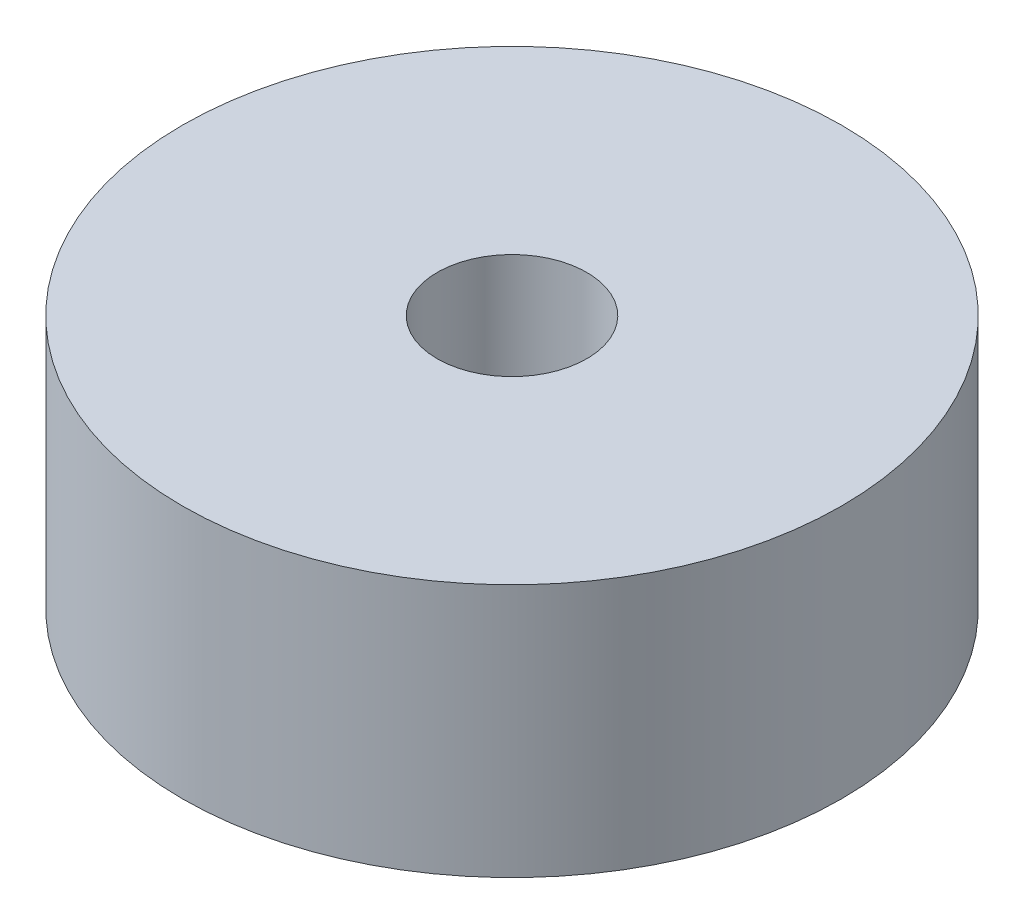
ISO-10303-21;
HEADER;
FILE_DESCRIPTION(('STEP AP214'),'2;1');
FILE_NAME('part.step','',(''),(''),'','','');
FILE_SCHEMA(('AUTOMOTIVE_DESIGN { 1 0 10303 214 1 1 1 1 }'));
ENDSEC;
DATA;
#1=APPLICATION_CONTEXT('core data for automotive mechanical design processes');
#2=APPLICATION_PROTOCOL_DEFINITION('international standard','automotive_design',2000,#1);
#3=PRODUCT_CONTEXT('',#1,'mechanical');
#4=PRODUCT('Part','Part','',(#3));
#5=PRODUCT_RELATED_PRODUCT_CATEGORY('part','',(#4));
#6=PRODUCT_DEFINITION_FORMATION('','',#4);
#7=PRODUCT_DEFINITION_CONTEXT('part definition',#1,'design');
#8=PRODUCT_DEFINITION('design','',#6,#7);
#9=PRODUCT_DEFINITION_SHAPE('','',#8);
#10=(LENGTH_UNIT() NAMED_UNIT(*) SI_UNIT(.MILLI.,.METRE.));
#11=(NAMED_UNIT(*) PLANE_ANGLE_UNIT() SI_UNIT($,.RADIAN.));
#12=(NAMED_UNIT(*) SI_UNIT($,.STERADIAN.) SOLID_ANGLE_UNIT());
#13=UNCERTAINTY_MEASURE_WITH_UNIT(LENGTH_MEASURE(1.E-05),#10,'distance_accuracy_value','');
#14=(GEOMETRIC_REPRESENTATION_CONTEXT(3) GLOBAL_UNCERTAINTY_ASSIGNED_CONTEXT((#13)) GLOBAL_UNIT_ASSIGNED_CONTEXT((#10,
#11,#12)) REPRESENTATION_CONTEXT('',''));
#15=CARTESIAN_POINT('',(0.,0.,0.));
#16=DIRECTION('',(0.,0.,1.));
#17=DIRECTION('',(1.,0.,0.));
#18=AXIS2_PLACEMENT_3D('',#15,#16,#17);
#19=CARTESIAN_POINT('',(0.,5.,0.));
#20=DIRECTION('',(0.,1.,0.));
#21=DIRECTION('',(0.,0.,1.));
#22=AXIS2_PLACEMENT_3D('',#19,#20,#21);
#23=PLANE('',#22);
#24=CARTESIAN_POINT('',(0.,5.,0.));
#25=DIRECTION('',(0.,1.,0.));
#26=DIRECTION('',(0.,0.,1.));
#27=AXIS2_PLACEMENT_3D('',#24,#25,#26);
#28=CIRCLE('',#27,6.5);
#29=CARTESIAN_POINT('',(0.,5.,6.5));
#30=VERTEX_POINT('',#29);
#31=EDGE_CURVE('E11',#30,#30,#28,.T.);
#32=ORIENTED_EDGE('',*,*,#31,.T.);
#33=EDGE_LOOP('',(#32));
#34=FACE_BOUND('',#33,.T.);
#35=CARTESIAN_POINT('',(0.,5.,0.));
#36=DIRECTION('',(0.,1.,0.));
#37=DIRECTION('',(0.,0.,1.));
#38=AXIS2_PLACEMENT_3D('',#35,#36,#37);
#39=CIRCLE('',#38,1.475);
#40=CARTESIAN_POINT('',(0.,5.,1.475));
#41=VERTEX_POINT('',#40);
#42=EDGE_CURVE('E51',#41,#41,#39,.T.);
#43=ORIENTED_EDGE('',*,*,#42,.F.);
#44=EDGE_LOOP('',(#43));
#45=FACE_BOUND('',#44,.T.);
#46=ADVANCED_FACE('F38',(#34,#45),#23,.T.);
#47=CARTESIAN_POINT('',(0.,0.,0.));
#48=DIRECTION('',(0.,1.,0.));
#49=DIRECTION('',(0.,0.,1.));
#50=AXIS2_PLACEMENT_3D('',#47,#48,#49);
#51=PLANE('',#50);
#52=CARTESIAN_POINT('',(0.,0.,0.));
#53=DIRECTION('',(0.,1.,0.));
#54=DIRECTION('',(0.,0.,1.));
#55=AXIS2_PLACEMENT_3D('',#52,#53,#54);
#56=CIRCLE('',#55,6.5);
#57=CARTESIAN_POINT('',(0.,0.,6.5));
#58=VERTEX_POINT('',#57);
#59=EDGE_CURVE('E42',#58,#58,#56,.T.);
#60=ORIENTED_EDGE('',*,*,#59,.F.);
#61=EDGE_LOOP('',(#60));
#62=FACE_BOUND('',#61,.T.);
#63=CARTESIAN_POINT('',(0.,0.,0.));
#64=DIRECTION('',(0.,1.,0.));
#65=DIRECTION('',(0.,0.,1.));
#66=AXIS2_PLACEMENT_3D('',#63,#64,#65);
#67=CIRCLE('',#66,1.475);
#68=CARTESIAN_POINT('',(0.,0.,1.475));
#69=VERTEX_POINT('',#68);
#70=EDGE_CURVE('E54',#69,#69,#67,.T.);
#71=ORIENTED_EDGE('',*,*,#70,.T.);
#72=EDGE_LOOP('',(#71));
#73=FACE_BOUND('',#72,.T.);
#74=ADVANCED_FACE('F64',(#62,#73),#51,.F.);
#75=CARTESIAN_POINT('',(0.,5.,0.));
#76=DIRECTION('',(0.,-1.,0.));
#77=DIRECTION('',(0.,0.,-1.));
#78=AXIS2_PLACEMENT_3D('',#75,#76,#77);
#79=CYLINDRICAL_SURFACE('',#78,6.5);
#80=ORIENTED_EDGE('',*,*,#31,.F.);
#81=EDGE_LOOP('',(#80));
#82=FACE_BOUND('',#81,.T.);
#83=ORIENTED_EDGE('',*,*,#59,.T.);
#84=EDGE_LOOP('',(#83));
#85=FACE_BOUND('',#84,.T.);
#86=ADVANCED_FACE('F40',(#82,#85),#79,.T.);
#87=CARTESIAN_POINT('',(0.,5.,0.));
#88=DIRECTION('',(0.,-1.,0.));
#89=DIRECTION('',(0.,0.,-1.));
#90=AXIS2_PLACEMENT_3D('',#87,#88,#89);
#91=CYLINDRICAL_SURFACE('',#90,1.475);
#92=ORIENTED_EDGE('',*,*,#42,.T.);
#93=EDGE_LOOP('',(#92));
#94=FACE_BOUND('',#93,.T.);
#95=ORIENTED_EDGE('',*,*,#70,.F.);
#96=EDGE_LOOP('',(#95));
#97=FACE_BOUND('',#96,.T.);
#98=ADVANCED_FACE('F60',(#94,#97),#91,.F.);
#99=CLOSED_SHELL('',(#46,#74,#86,#98));
#100=MANIFOLD_SOLID_BREP('B2',#99);
#101=ADVANCED_BREP_SHAPE_REPRESENTATION('',(#18,#100),#14);
#102=SHAPE_DEFINITION_REPRESENTATION(#9,#101);
ENDSEC;
END-ISO-10303-21;
